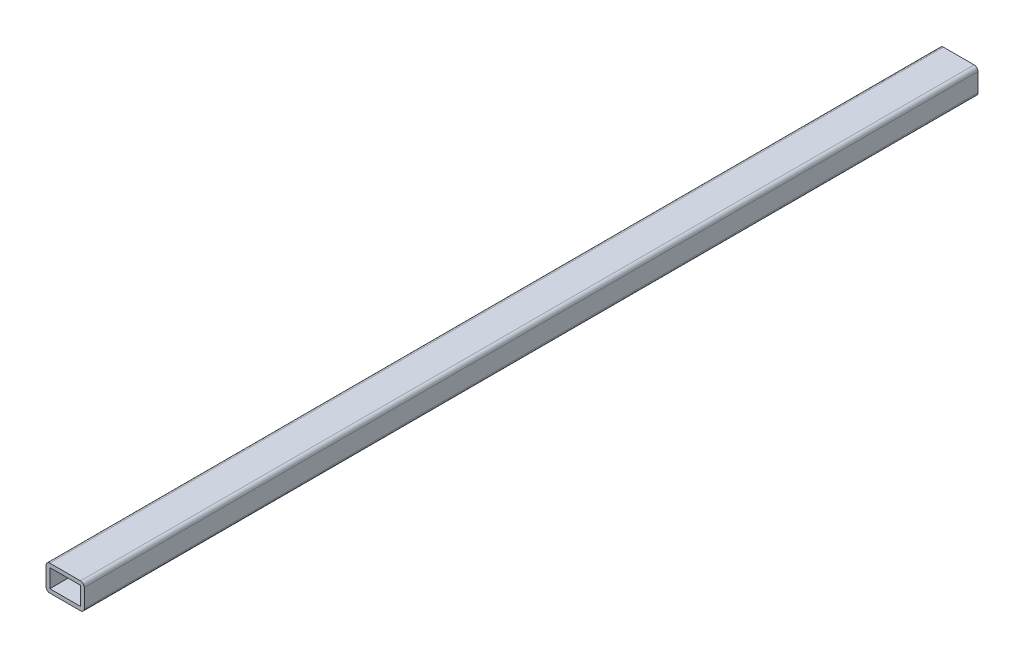
ISO-10303-21;
HEADER;
FILE_DESCRIPTION(('STEP AP214'),'2;1');
FILE_NAME('part.step','',(''),(''),'','','');
FILE_SCHEMA(('AUTOMOTIVE_DESIGN { 1 0 10303 214 1 1 1 1 }'));
ENDSEC;
DATA;
#1=APPLICATION_CONTEXT('core data for automotive mechanical design processes');
#2=APPLICATION_PROTOCOL_DEFINITION('international standard','automotive_design',2000,#1);
#3=PRODUCT_CONTEXT('',#1,'mechanical');
#4=PRODUCT('Part','Part','',(#3));
#5=PRODUCT_RELATED_PRODUCT_CATEGORY('part','',(#4));
#6=PRODUCT_DEFINITION_FORMATION('','',#4);
#7=PRODUCT_DEFINITION_CONTEXT('part definition',#1,'design');
#8=PRODUCT_DEFINITION('design','',#6,#7);
#9=PRODUCT_DEFINITION_SHAPE('','',#8);
#10=(LENGTH_UNIT() NAMED_UNIT(*) SI_UNIT(.MILLI.,.METRE.));
#11=(NAMED_UNIT(*) PLANE_ANGLE_UNIT() SI_UNIT($,.RADIAN.));
#12=(NAMED_UNIT(*) SI_UNIT($,.STERADIAN.) SOLID_ANGLE_UNIT());
#13=UNCERTAINTY_MEASURE_WITH_UNIT(LENGTH_MEASURE(1.E-05),#10,'distance_accuracy_value','');
#14=(GEOMETRIC_REPRESENTATION_CONTEXT(3) GLOBAL_UNCERTAINTY_ASSIGNED_CONTEXT((#13)) GLOBAL_UNIT_ASSIGNED_CONTEXT((#10,
#11,#12)) REPRESENTATION_CONTEXT('',''));
#15=CARTESIAN_POINT('',(0.,0.,0.));
#16=DIRECTION('',(0.,0.,1.));
#17=DIRECTION('',(1.,0.,0.));
#18=AXIS2_PLACEMENT_3D('',#15,#16,#17);
#19=CARTESIAN_POINT('',(3.,17.3315278698919,700.));
#20=DIRECTION('',(0.,0.,1.));
#21=DIRECTION('',(1.,0.,0.));
#22=AXIS2_PLACEMENT_3D('',#19,#20,#21);
#23=PLANE('',#22);
#24=CARTESIAN_POINT('',(3.,17.3315278698919,700.));
#25=DIRECTION('',(0.,0.,1.));
#26=DIRECTION('',(1.,0.,0.));
#27=AXIS2_PLACEMENT_3D('',#24,#25,#26);
#28=CIRCLE('',#27,3.);
#29=CARTESIAN_POINT('',(3.,20.3315278698919,700.));
#30=VERTEX_POINT('',#29);
#31=CARTESIAN_POINT('',(0.,17.3315278698919,700.));
#32=VERTEX_POINT('',#31);
#33=EDGE_CURVE('E180',#30,#32,#28,.T.);
#34=ORIENTED_EDGE('',*,*,#33,.T.);
#35=DIRECTION('',(0.,-1.,0.));
#36=VECTOR('',#35,1.);
#37=CARTESIAN_POINT('',(0.,3.,700.));
#38=LINE('',#37,#36);
#39=CARTESIAN_POINT('',(0.,3.,700.));
#40=VERTEX_POINT('',#39);
#41=EDGE_CURVE('E184',#32,#40,#38,.T.);
#42=ORIENTED_EDGE('',*,*,#41,.T.);
#43=CARTESIAN_POINT('',(3.,3.,700.));
#44=DIRECTION('',(0.,0.,1.));
#45=DIRECTION('',(1.,0.,0.));
#46=AXIS2_PLACEMENT_3D('',#43,#44,#45);
#47=CIRCLE('',#46,3.);
#48=CARTESIAN_POINT('',(3.,0.,700.));
#49=VERTEX_POINT('',#48);
#50=EDGE_CURVE('E188',#40,#49,#47,.T.);
#51=ORIENTED_EDGE('',*,*,#50,.T.);
#52=DIRECTION('',(1.,0.,0.));
#53=VECTOR('',#52,1.);
#54=CARTESIAN_POINT('',(3.,0.,700.));
#55=LINE('',#54,#53);
#56=CARTESIAN_POINT('',(27.,0.,700.));
#57=VERTEX_POINT('',#56);
#58=EDGE_CURVE('E191',#49,#57,#55,.T.);
#59=ORIENTED_EDGE('',*,*,#58,.T.);
#60=CARTESIAN_POINT('',(27.,3.,700.));
#61=DIRECTION('',(0.,0.,1.));
#62=DIRECTION('',(1.,0.,0.));
#63=AXIS2_PLACEMENT_3D('',#60,#61,#62);
#64=CIRCLE('',#63,3.);
#65=CARTESIAN_POINT('',(30.,3.,700.));
#66=VERTEX_POINT('',#65);
#67=EDGE_CURVE('E194',#57,#66,#64,.T.);
#68=ORIENTED_EDGE('',*,*,#67,.T.);
#69=DIRECTION('',(0.,1.,0.));
#70=VECTOR('',#69,1.);
#71=CARTESIAN_POINT('',(30.,3.,700.));
#72=LINE('',#71,#70);
#73=CARTESIAN_POINT('',(30.,17.3315278698919,700.));
#74=VERTEX_POINT('',#73);
#75=EDGE_CURVE('E197',#66,#74,#72,.T.);
#76=ORIENTED_EDGE('',*,*,#75,.T.);
#77=CARTESIAN_POINT('',(27.,17.3315278698919,700.));
#78=DIRECTION('',(0.,0.,1.));
#79=DIRECTION('',(1.,0.,0.));
#80=AXIS2_PLACEMENT_3D('',#77,#78,#79);
#81=CIRCLE('',#80,3.);
#82=CARTESIAN_POINT('',(27.,20.3315278698919,700.));
#83=VERTEX_POINT('',#82);
#84=EDGE_CURVE('E200',#74,#83,#81,.T.);
#85=ORIENTED_EDGE('',*,*,#84,.T.);
#86=DIRECTION('',(-1.,0.,0.));
#87=VECTOR('',#86,1.);
#88=CARTESIAN_POINT('',(3.,20.3315278698919,700.));
#89=LINE('',#88,#87);
#90=EDGE_CURVE('E203',#83,#30,#89,.T.);
#91=ORIENTED_EDGE('',*,*,#90,.T.);
#92=EDGE_LOOP('',(#34,#42,#51,#59,#68,#76,#85,#91));
#93=FACE_BOUND('',#92,.T.);
#94=DIRECTION('',(1.,0.,0.));
#95=VECTOR('',#94,1.);
#96=CARTESIAN_POINT('',(27.,3.,700.));
#97=LINE('',#96,#95);
#98=CARTESIAN_POINT('',(3.,3.,700.));
#99=VERTEX_POINT('',#98);
#100=CARTESIAN_POINT('',(27.,3.,700.));
#101=VERTEX_POINT('',#100);
#102=EDGE_CURVE('E141',#99,#101,#97,.T.);
#103=ORIENTED_EDGE('',*,*,#102,.F.);
#104=DIRECTION('',(0.,-1.,0.));
#105=VECTOR('',#104,1.);
#106=CARTESIAN_POINT('',(3.,3.,700.));
#107=LINE('',#106,#105);
#108=CARTESIAN_POINT('',(3.,17.3315278698919,700.));
#109=VERTEX_POINT('',#108);
#110=EDGE_CURVE('E132',#109,#99,#107,.T.);
#111=ORIENTED_EDGE('',*,*,#110,.F.);
#112=DIRECTION('',(-1.,0.,0.));
#113=VECTOR('',#112,1.);
#114=CARTESIAN_POINT('',(3.,17.3315278698919,700.));
#115=LINE('',#114,#113);
#116=CARTESIAN_POINT('',(27.,17.3315278698919,700.));
#117=VERTEX_POINT('',#116);
#118=EDGE_CURVE('E158',#117,#109,#115,.T.);
#119=ORIENTED_EDGE('',*,*,#118,.F.);
#120=DIRECTION('',(0.,1.,0.));
#121=VECTOR('',#120,1.);
#122=CARTESIAN_POINT('',(27.,17.3315278698919,700.));
#123=LINE('',#122,#121);
#124=EDGE_CURVE('E154',#101,#117,#123,.T.);
#125=ORIENTED_EDGE('',*,*,#124,.F.);
#126=EDGE_LOOP('',(#103,#111,#119,#125));
#127=FACE_BOUND('',#126,.T.);
#128=ADVANCED_FACE('F42',(#93,#127),#23,.T.);
#129=CARTESIAN_POINT('',(3.,17.3315278698919,0.));
#130=DIRECTION('',(0.,0.,1.));
#131=DIRECTION('',(1.,0.,0.));
#132=AXIS2_PLACEMENT_3D('',#129,#130,#131);
#133=PLANE('',#132);
#134=CARTESIAN_POINT('',(3.,17.3315278698919,0.));
#135=DIRECTION('',(0.,0.,1.));
#136=DIRECTION('',(1.,0.,0.));
#137=AXIS2_PLACEMENT_3D('',#134,#135,#136);
#138=CIRCLE('',#137,3.);
#139=CARTESIAN_POINT('',(3.,20.3315278698919,0.));
#140=VERTEX_POINT('',#139);
#141=CARTESIAN_POINT('',(0.,17.3315278698919,0.));
#142=VERTEX_POINT('',#141);
#143=EDGE_CURVE('E150',#140,#142,#138,.T.);
#144=ORIENTED_EDGE('',*,*,#143,.F.);
#145=DIRECTION('',(-1.,0.,0.));
#146=VECTOR('',#145,1.);
#147=CARTESIAN_POINT('',(3.,20.3315278698919,0.));
#148=LINE('',#147,#146);
#149=CARTESIAN_POINT('',(27.,20.3315278698919,0.));
#150=VERTEX_POINT('',#149);
#151=EDGE_CURVE('E185',#150,#140,#148,.T.);
#152=ORIENTED_EDGE('',*,*,#151,.F.);
#153=CARTESIAN_POINT('',(27.,17.3315278698919,0.));
#154=DIRECTION('',(0.,0.,1.));
#155=DIRECTION('',(1.,0.,0.));
#156=AXIS2_PLACEMENT_3D('',#153,#154,#155);
#157=CIRCLE('',#156,3.);
#158=CARTESIAN_POINT('',(30.,17.3315278698919,0.));
#159=VERTEX_POINT('',#158);
#160=EDGE_CURVE('E225',#159,#150,#157,.T.);
#161=ORIENTED_EDGE('',*,*,#160,.F.);
#162=DIRECTION('',(0.,1.,0.));
#163=VECTOR('',#162,1.);
#164=CARTESIAN_POINT('',(30.,3.,0.));
#165=LINE('',#164,#163);
#166=CARTESIAN_POINT('',(30.,3.,0.));
#167=VERTEX_POINT('',#166);
#168=EDGE_CURVE('E222',#167,#159,#165,.T.);
#169=ORIENTED_EDGE('',*,*,#168,.F.);
#170=CARTESIAN_POINT('',(27.,3.,0.));
#171=DIRECTION('',(0.,0.,1.));
#172=DIRECTION('',(1.,0.,0.));
#173=AXIS2_PLACEMENT_3D('',#170,#171,#172);
#174=CIRCLE('',#173,3.);
#175=CARTESIAN_POINT('',(27.,0.,0.));
#176=VERTEX_POINT('',#175);
#177=EDGE_CURVE('E219',#176,#167,#174,.T.);
#178=ORIENTED_EDGE('',*,*,#177,.F.);
#179=DIRECTION('',(1.,0.,0.));
#180=VECTOR('',#179,1.);
#181=CARTESIAN_POINT('',(3.,0.,0.));
#182=LINE('',#181,#180);
#183=CARTESIAN_POINT('',(3.,0.,0.));
#184=VERTEX_POINT('',#183);
#185=EDGE_CURVE('E216',#184,#176,#182,.T.);
#186=ORIENTED_EDGE('',*,*,#185,.F.);
#187=CARTESIAN_POINT('',(3.,3.,0.));
#188=DIRECTION('',(0.,0.,1.));
#189=DIRECTION('',(1.,0.,0.));
#190=AXIS2_PLACEMENT_3D('',#187,#188,#189);
#191=CIRCLE('',#190,3.);
#192=CARTESIAN_POINT('',(0.,3.,0.));
#193=VERTEX_POINT('',#192);
#194=EDGE_CURVE('E213',#193,#184,#191,.T.);
#195=ORIENTED_EDGE('',*,*,#194,.F.);
#196=DIRECTION('',(0.,-1.,0.));
#197=VECTOR('',#196,1.);
#198=CARTESIAN_POINT('',(0.,3.,0.));
#199=LINE('',#198,#197);
#200=EDGE_CURVE('E210',#142,#193,#199,.T.);
#201=ORIENTED_EDGE('',*,*,#200,.F.);
#202=EDGE_LOOP('',(#144,#152,#161,#169,#178,#186,#195,#201));
#203=FACE_BOUND('',#202,.T.);
#204=DIRECTION('',(0.,-1.,0.));
#205=VECTOR('',#204,1.);
#206=CARTESIAN_POINT('',(3.,3.,0.));
#207=LINE('',#206,#205);
#208=CARTESIAN_POINT('',(3.,17.3315278698919,0.));
#209=VERTEX_POINT('',#208);
#210=CARTESIAN_POINT('',(3.,3.,0.));
#211=VERTEX_POINT('',#210);
#212=EDGE_CURVE('E66',#209,#211,#207,.T.);
#213=ORIENTED_EDGE('',*,*,#212,.T.);
#214=DIRECTION('',(1.,0.,0.));
#215=VECTOR('',#214,1.);
#216=CARTESIAN_POINT('',(27.,3.,0.));
#217=LINE('',#216,#215);
#218=CARTESIAN_POINT('',(27.,3.,0.));
#219=VERTEX_POINT('',#218);
#220=EDGE_CURVE('E148',#211,#219,#217,.T.);
#221=ORIENTED_EDGE('',*,*,#220,.T.);
#222=DIRECTION('',(0.,1.,0.));
#223=VECTOR('',#222,1.);
#224=CARTESIAN_POINT('',(27.,17.3315278698919,0.));
#225=LINE('',#224,#223);
#226=CARTESIAN_POINT('',(27.,17.3315278698919,0.));
#227=VERTEX_POINT('',#226);
#228=EDGE_CURVE('E167',#219,#227,#225,.T.);
#229=ORIENTED_EDGE('',*,*,#228,.T.);
#230=DIRECTION('',(-1.,0.,0.));
#231=VECTOR('',#230,1.);
#232=CARTESIAN_POINT('',(3.,17.3315278698919,0.));
#233=LINE('',#232,#231);
#234=EDGE_CURVE('E142',#227,#209,#233,.T.);
#235=ORIENTED_EDGE('',*,*,#234,.T.);
#236=EDGE_LOOP('',(#213,#221,#229,#235));
#237=FACE_BOUND('',#236,.T.);
#238=ADVANCED_FACE('F264',(#203,#237),#133,.F.);
#239=CARTESIAN_POINT('',(3.,17.3315278698919,700.));
#240=DIRECTION('',(0.,0.,-1.));
#241=DIRECTION('',(-1.,0.,0.));
#242=AXIS2_PLACEMENT_3D('',#239,#240,#241);
#243=CYLINDRICAL_SURFACE('',#242,3.);
#244=ORIENTED_EDGE('',*,*,#143,.T.);
#245=DIRECTION('',(0.,0.,-1.));
#246=VECTOR('',#245,1.);
#247=CARTESIAN_POINT('',(0.,17.3315278698919,700.));
#248=LINE('',#247,#246);
#249=EDGE_CURVE('E11',#32,#142,#248,.T.);
#250=ORIENTED_EDGE('',*,*,#249,.F.);
#251=ORIENTED_EDGE('',*,*,#33,.F.);
#252=DIRECTION('',(0.,0.,-1.));
#253=VECTOR('',#252,1.);
#254=CARTESIAN_POINT('',(3.,20.3315278698919,700.));
#255=LINE('',#254,#253);
#256=EDGE_CURVE('E206',#30,#140,#255,.T.);
#257=ORIENTED_EDGE('',*,*,#256,.T.);
#258=EDGE_LOOP('',(#244,#250,#251,#257));
#259=FACE_BOUND('',#258,.T.);
#260=ADVANCED_FACE('F44',(#259),#243,.T.);
#261=CARTESIAN_POINT('',(0.,3.,700.));
#262=DIRECTION('',(1.,0.,0.));
#263=DIRECTION('',(0.,1.,0.));
#264=AXIS2_PLACEMENT_3D('',#261,#262,#263);
#265=PLANE('',#264);
#266=ORIENTED_EDGE('',*,*,#200,.T.);
#267=DIRECTION('',(0.,0.,-1.));
#268=VECTOR('',#267,1.);
#269=CARTESIAN_POINT('',(0.,3.,700.));
#270=LINE('',#269,#268);
#271=EDGE_CURVE('E51',#40,#193,#270,.T.);
#272=ORIENTED_EDGE('',*,*,#271,.F.);
#273=ORIENTED_EDGE('',*,*,#41,.F.);
#274=ORIENTED_EDGE('',*,*,#249,.T.);
#275=EDGE_LOOP('',(#266,#272,#273,#274));
#276=FACE_BOUND('',#275,.T.);
#277=ADVANCED_FACE('F281',(#276),#265,.F.);
#278=CARTESIAN_POINT('',(3.,3.,700.));
#279=DIRECTION('',(0.,0.,-1.));
#280=DIRECTION('',(-1.,0.,0.));
#281=AXIS2_PLACEMENT_3D('',#278,#279,#280);
#282=CYLINDRICAL_SURFACE('',#281,3.);
#283=ORIENTED_EDGE('',*,*,#194,.T.);
#284=DIRECTION('',(0.,0.,-1.));
#285=VECTOR('',#284,1.);
#286=CARTESIAN_POINT('',(3.,0.,700.));
#287=LINE('',#286,#285);
#288=EDGE_CURVE('E249',#49,#184,#287,.T.);
#289=ORIENTED_EDGE('',*,*,#288,.F.);
#290=ORIENTED_EDGE('',*,*,#50,.F.);
#291=ORIENTED_EDGE('',*,*,#271,.T.);
#292=EDGE_LOOP('',(#283,#289,#290,#291));
#293=FACE_BOUND('',#292,.T.);
#294=ADVANCED_FACE('F258',(#293),#282,.T.);
#295=CARTESIAN_POINT('',(3.,0.,700.));
#296=DIRECTION('',(0.,1.,0.));
#297=DIRECTION('',(-1.,0.,0.));
#298=AXIS2_PLACEMENT_3D('',#295,#296,#297);
#299=PLANE('',#298);
#300=ORIENTED_EDGE('',*,*,#185,.T.);
#301=DIRECTION('',(0.,0.,-1.));
#302=VECTOR('',#301,1.);
#303=CARTESIAN_POINT('',(27.,0.,700.));
#304=LINE('',#303,#302);
#305=EDGE_CURVE('E245',#57,#176,#304,.T.);
#306=ORIENTED_EDGE('',*,*,#305,.F.);
#307=ORIENTED_EDGE('',*,*,#58,.F.);
#308=ORIENTED_EDGE('',*,*,#288,.T.);
#309=EDGE_LOOP('',(#300,#306,#307,#308));
#310=FACE_BOUND('',#309,.T.);
#311=ADVANCED_FACE('F270',(#310),#299,.F.);
#312=CARTESIAN_POINT('',(27.,3.,700.));
#313=DIRECTION('',(0.,0.,-1.));
#314=DIRECTION('',(-1.,0.,0.));
#315=AXIS2_PLACEMENT_3D('',#312,#313,#314);
#316=CYLINDRICAL_SURFACE('',#315,3.);
#317=ORIENTED_EDGE('',*,*,#177,.T.);
#318=DIRECTION('',(0.,0.,-1.));
#319=VECTOR('',#318,1.);
#320=CARTESIAN_POINT('',(30.,3.,700.));
#321=LINE('',#320,#319);
#322=EDGE_CURVE('E241',#66,#167,#321,.T.);
#323=ORIENTED_EDGE('',*,*,#322,.F.);
#324=ORIENTED_EDGE('',*,*,#67,.F.);
#325=ORIENTED_EDGE('',*,*,#305,.T.);
#326=EDGE_LOOP('',(#317,#323,#324,#325));
#327=FACE_BOUND('',#326,.T.);
#328=ADVANCED_FACE('F274',(#327),#316,.T.);
#329=CARTESIAN_POINT('',(30.,3.,700.));
#330=DIRECTION('',(-1.,0.,0.));
#331=DIRECTION('',(0.,0.,1.));
#332=AXIS2_PLACEMENT_3D('',#329,#330,#331);
#333=PLANE('',#332);
#334=ORIENTED_EDGE('',*,*,#168,.T.);
#335=DIRECTION('',(0.,0.,-1.));
#336=VECTOR('',#335,1.);
#337=CARTESIAN_POINT('',(30.,17.3315278698919,700.));
#338=LINE('',#337,#336);
#339=EDGE_CURVE('E237',#74,#159,#338,.T.);
#340=ORIENTED_EDGE('',*,*,#339,.F.);
#341=ORIENTED_EDGE('',*,*,#75,.F.);
#342=ORIENTED_EDGE('',*,*,#322,.T.);
#343=EDGE_LOOP('',(#334,#340,#341,#342));
#344=FACE_BOUND('',#343,.T.);
#345=ADVANCED_FACE('F294',(#344),#333,.F.);
#346=CARTESIAN_POINT('',(27.,17.3315278698919,700.));
#347=DIRECTION('',(0.,0.,-1.));
#348=DIRECTION('',(-1.,0.,0.));
#349=AXIS2_PLACEMENT_3D('',#346,#347,#348);
#350=CYLINDRICAL_SURFACE('',#349,3.);
#351=ORIENTED_EDGE('',*,*,#160,.T.);
#352=DIRECTION('',(0.,0.,-1.));
#353=VECTOR('',#352,1.);
#354=CARTESIAN_POINT('',(27.,20.3315278698919,700.));
#355=LINE('',#354,#353);
#356=EDGE_CURVE('E233',#83,#150,#355,.T.);
#357=ORIENTED_EDGE('',*,*,#356,.F.);
#358=ORIENTED_EDGE('',*,*,#84,.F.);
#359=ORIENTED_EDGE('',*,*,#339,.T.);
#360=EDGE_LOOP('',(#351,#357,#358,#359));
#361=FACE_BOUND('',#360,.T.);
#362=ADVANCED_FACE('F292',(#361),#350,.T.);
#363=CARTESIAN_POINT('',(3.,20.3315278698919,700.));
#364=DIRECTION('',(0.,-1.,0.));
#365=DIRECTION('',(0.,0.,-1.));
#366=AXIS2_PLACEMENT_3D('',#363,#364,#365);
#367=PLANE('',#366);
#368=ORIENTED_EDGE('',*,*,#151,.T.);
#369=ORIENTED_EDGE('',*,*,#256,.F.);
#370=ORIENTED_EDGE('',*,*,#90,.F.);
#371=ORIENTED_EDGE('',*,*,#356,.T.);
#372=EDGE_LOOP('',(#368,#369,#370,#371));
#373=FACE_BOUND('',#372,.T.);
#374=ADVANCED_FACE('F287',(#373),#367,.F.);
#375=CARTESIAN_POINT('',(3.,3.,700.));
#376=DIRECTION('',(1.,0.,0.));
#377=DIRECTION('',(0.,1.,0.));
#378=AXIS2_PLACEMENT_3D('',#375,#376,#377);
#379=PLANE('',#378);
#380=ORIENTED_EDGE('',*,*,#212,.F.);
#381=DIRECTION('',(0.,0.,-1.));
#382=VECTOR('',#381,1.);
#383=CARTESIAN_POINT('',(3.,17.3315278698919,700.));
#384=LINE('',#383,#382);
#385=EDGE_CURVE('E136',#109,#209,#384,.T.);
#386=ORIENTED_EDGE('',*,*,#385,.F.);
#387=ORIENTED_EDGE('',*,*,#110,.T.);
#388=DIRECTION('',(0.,0.,-1.));
#389=VECTOR('',#388,1.);
#390=CARTESIAN_POINT('',(3.,3.,700.));
#391=LINE('',#390,#389);
#392=EDGE_CURVE('E135',#99,#211,#391,.T.);
#393=ORIENTED_EDGE('',*,*,#392,.T.);
#394=EDGE_LOOP('',(#380,#386,#387,#393));
#395=FACE_BOUND('',#394,.T.);
#396=ADVANCED_FACE('F134',(#395),#379,.T.);
#397=CARTESIAN_POINT('',(27.,3.,700.));
#398=DIRECTION('',(0.,1.,0.));
#399=DIRECTION('',(-1.,0.,0.));
#400=AXIS2_PLACEMENT_3D('',#397,#398,#399);
#401=PLANE('',#400);
#402=ORIENTED_EDGE('',*,*,#220,.F.);
#403=ORIENTED_EDGE('',*,*,#392,.F.);
#404=ORIENTED_EDGE('',*,*,#102,.T.);
#405=DIRECTION('',(0.,0.,-1.));
#406=VECTOR('',#405,1.);
#407=CARTESIAN_POINT('',(27.,3.,700.));
#408=LINE('',#407,#406);
#409=EDGE_CURVE('E151',#101,#219,#408,.T.);
#410=ORIENTED_EDGE('',*,*,#409,.T.);
#411=EDGE_LOOP('',(#402,#403,#404,#410));
#412=FACE_BOUND('',#411,.T.);
#413=ADVANCED_FACE('F145',(#412),#401,.T.);
#414=CARTESIAN_POINT('',(27.,17.3315278698919,700.));
#415=DIRECTION('',(-1.,0.,0.));
#416=DIRECTION('',(0.,0.,1.));
#417=AXIS2_PLACEMENT_3D('',#414,#415,#416);
#418=PLANE('',#417);
#419=ORIENTED_EDGE('',*,*,#228,.F.);
#420=ORIENTED_EDGE('',*,*,#409,.F.);
#421=ORIENTED_EDGE('',*,*,#124,.T.);
#422=DIRECTION('',(0.,0.,-1.));
#423=VECTOR('',#422,1.);
#424=CARTESIAN_POINT('',(27.,17.3315278698919,700.));
#425=LINE('',#424,#423);
#426=EDGE_CURVE('E58',#117,#227,#425,.T.);
#427=ORIENTED_EDGE('',*,*,#426,.T.);
#428=EDGE_LOOP('',(#419,#420,#421,#427));
#429=FACE_BOUND('',#428,.T.);
#430=ADVANCED_FACE('F319',(#429),#418,.T.);
#431=CARTESIAN_POINT('',(3.,17.3315278698919,700.));
#432=DIRECTION('',(0.,-1.,0.));
#433=DIRECTION('',(0.,0.,-1.));
#434=AXIS2_PLACEMENT_3D('',#431,#432,#433);
#435=PLANE('',#434);
#436=ORIENTED_EDGE('',*,*,#234,.F.);
#437=ORIENTED_EDGE('',*,*,#426,.F.);
#438=ORIENTED_EDGE('',*,*,#118,.T.);
#439=ORIENTED_EDGE('',*,*,#385,.T.);
#440=EDGE_LOOP('',(#436,#437,#438,#439));
#441=FACE_BOUND('',#440,.T.);
#442=ADVANCED_FACE('F323',(#441),#435,.T.);
#443=CLOSED_SHELL('',(#128,#238,#260,#277,#294,#311,#328,#345,#362,#374,#396,#413,#430,#442));
#444=MANIFOLD_SOLID_BREP('B2',#443);
#445=ADVANCED_BREP_SHAPE_REPRESENTATION('',(#18,#444),#14);
#446=SHAPE_DEFINITION_REPRESENTATION(#9,#445);
ENDSEC;
END-ISO-10303-21;
